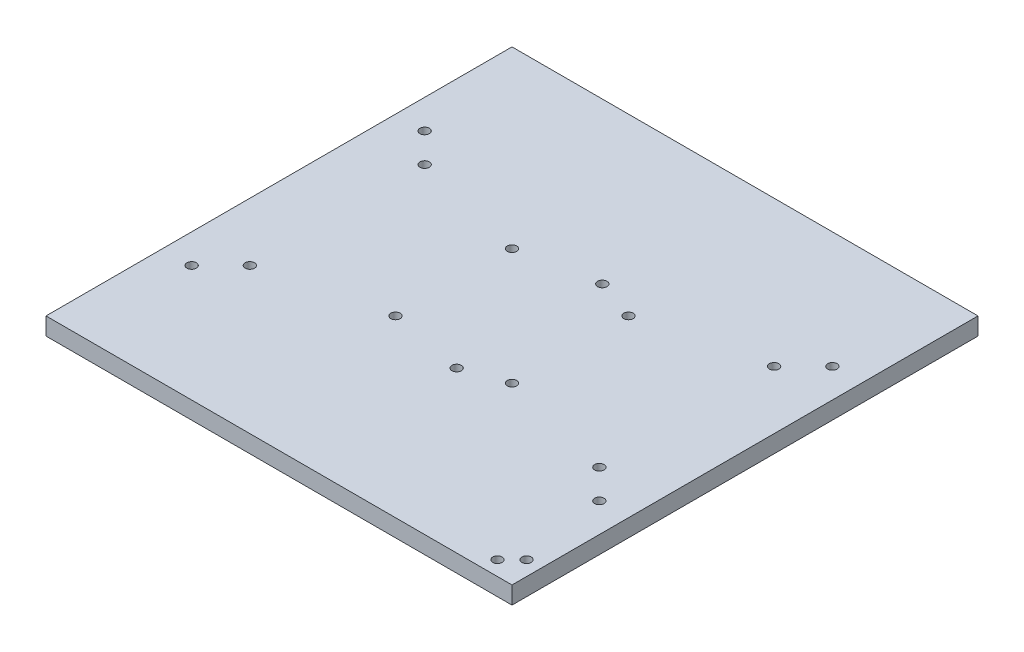
ISO-10303-21;
HEADER;
FILE_DESCRIPTION(('STEP AP214'),'2;1');
FILE_NAME('part.step','',(''),(''),'','','');
FILE_SCHEMA(('AUTOMOTIVE_DESIGN { 1 0 10303 214 1 1 1 1 }'));
ENDSEC;
DATA;
#1=APPLICATION_CONTEXT('core data for automotive mechanical design processes');
#2=APPLICATION_PROTOCOL_DEFINITION('international standard','automotive_design',2000,#1);
#3=PRODUCT_CONTEXT('',#1,'mechanical');
#4=PRODUCT('Part','Part','',(#3));
#5=PRODUCT_RELATED_PRODUCT_CATEGORY('part','',(#4));
#6=PRODUCT_DEFINITION_FORMATION('','',#4);
#7=PRODUCT_DEFINITION_CONTEXT('part definition',#1,'design');
#8=PRODUCT_DEFINITION('design','',#6,#7);
#9=PRODUCT_DEFINITION_SHAPE('','',#8);
#10=(LENGTH_UNIT() NAMED_UNIT(*) SI_UNIT(.MILLI.,.METRE.));
#11=(NAMED_UNIT(*) PLANE_ANGLE_UNIT() SI_UNIT($,.RADIAN.));
#12=(NAMED_UNIT(*) SI_UNIT($,.STERADIAN.) SOLID_ANGLE_UNIT());
#13=UNCERTAINTY_MEASURE_WITH_UNIT(LENGTH_MEASURE(1.E-05),#10,'distance_accuracy_value','');
#14=(GEOMETRIC_REPRESENTATION_CONTEXT(3) GLOBAL_UNCERTAINTY_ASSIGNED_CONTEXT((#13)) GLOBAL_UNIT_ASSIGNED_CONTEXT((#10,
#11,#12)) REPRESENTATION_CONTEXT('',''));
#15=CARTESIAN_POINT('',(0.,0.,0.));
#16=DIRECTION('',(0.,0.,1.));
#17=DIRECTION('',(1.,0.,0.));
#18=AXIS2_PLACEMENT_3D('',#15,#16,#17);
#19=CARTESIAN_POINT('',(0.,6.,0.));
#20=DIRECTION('',(0.,1.,0.));
#21=DIRECTION('',(0.,0.,1.));
#22=AXIS2_PLACEMENT_3D('',#19,#20,#21);
#23=PLANE('',#22);
#24=CARTESIAN_POINT('',(75.,6.,70.));
#25=DIRECTION('',(0.,1.,0.));
#26=DIRECTION('',(0.,0.,1.));
#27=AXIS2_PLACEMENT_3D('',#24,#25,#26);
#28=CIRCLE('',#27,1.61925);
#29=CARTESIAN_POINT('',(75.,6.,71.61925));
#30=VERTEX_POINT('',#29);
#31=EDGE_CURVE('E159',#30,#30,#28,.T.);
#32=ORIENTED_EDGE('',*,*,#31,.F.);
#33=EDGE_LOOP('',(#32));
#34=FACE_BOUND('',#33,.T.);
#35=CARTESIAN_POINT('',(70.,6.,75.));
#36=DIRECTION('',(0.,1.,0.));
#37=DIRECTION('',(0.,0.,1.));
#38=AXIS2_PLACEMENT_3D('',#35,#36,#37);
#39=CIRCLE('',#38,1.61925);
#40=CARTESIAN_POINT('',(70.,6.,76.61925));
#41=VERTEX_POINT('',#40);
#42=EDGE_CURVE('E149',#41,#41,#39,.T.);
#43=ORIENTED_EDGE('',*,*,#42,.F.);
#44=EDGE_LOOP('',(#43));
#45=FACE_BOUND('',#44,.T.);
#46=CARTESIAN_POINT('',(6.,6.,25.));
#47=DIRECTION('',(0.,1.,0.));
#48=DIRECTION('',(0.,0.,1.));
#49=AXIS2_PLACEMENT_3D('',#46,#47,#48);
#50=CIRCLE('',#49,1.61925);
#51=CARTESIAN_POINT('',(6.,6.,26.61925));
#52=VERTEX_POINT('',#51);
#53=EDGE_CURVE('E146',#52,#52,#50,.T.);
#54=ORIENTED_EDGE('',*,*,#53,.F.);
#55=EDGE_LOOP('',(#54));
#56=FACE_BOUND('',#55,.T.);
#57=CARTESIAN_POINT('',(6.,6.,-25.));
#58=DIRECTION('',(0.,1.,0.));
#59=DIRECTION('',(0.,0.,1.));
#60=AXIS2_PLACEMENT_3D('',#57,#58,#59);
#61=CIRCLE('',#60,1.61925);
#62=CARTESIAN_POINT('',(6.,6.,-23.38075));
#63=VERTEX_POINT('',#62);
#64=EDGE_CURVE('E143',#63,#63,#61,.T.);
#65=ORIENTED_EDGE('',*,*,#64,.F.);
#66=EDGE_LOOP('',(#65));
#67=FACE_BOUND('',#66,.T.);
#68=CARTESIAN_POINT('',(20.,6.,-20.));
#69=DIRECTION('',(0.,1.,0.));
#70=DIRECTION('',(0.,0.,1.));
#71=AXIS2_PLACEMENT_3D('',#68,#69,#70);
#72=CIRCLE('',#71,1.61925);
#73=CARTESIAN_POINT('',(20.,6.,-18.38075));
#74=VERTEX_POINT('',#73);
#75=EDGE_CURVE('E133',#74,#74,#72,.T.);
#76=ORIENTED_EDGE('',*,*,#75,.F.);
#77=EDGE_LOOP('',(#76));
#78=FACE_BOUND('',#77,.T.);
#79=CARTESIAN_POINT('',(20.,6.,20.));
#80=DIRECTION('',(0.,1.,0.));
#81=DIRECTION('',(0.,0.,1.));
#82=AXIS2_PLACEMENT_3D('',#79,#80,#81);
#83=CIRCLE('',#82,1.61925);
#84=CARTESIAN_POINT('',(20.,6.,21.61925));
#85=VERTEX_POINT('',#84);
#86=EDGE_CURVE('E166',#85,#85,#83,.T.);
#87=ORIENTED_EDGE('',*,*,#86,.F.);
#88=EDGE_LOOP('',(#87));
#89=FACE_BOUND('',#88,.T.);
#90=CARTESIAN_POINT('',(-20.,6.,20.));
#91=DIRECTION('',(0.,1.,0.));
#92=DIRECTION('',(0.,0.,1.));
#93=AXIS2_PLACEMENT_3D('',#90,#91,#92);
#94=CIRCLE('',#93,1.61925);
#95=CARTESIAN_POINT('',(-20.,6.,21.61925));
#96=VERTEX_POINT('',#95);
#97=EDGE_CURVE('E142',#96,#96,#94,.T.);
#98=ORIENTED_EDGE('',*,*,#97,.F.);
#99=EDGE_LOOP('',(#98));
#100=FACE_BOUND('',#99,.T.);
#101=CARTESIAN_POINT('',(-20.,6.,-20.));
#102=DIRECTION('',(0.,1.,0.));
#103=DIRECTION('',(0.,0.,1.));
#104=AXIS2_PLACEMENT_3D('',#101,#102,#103);
#105=CIRCLE('',#104,1.61925);
#106=CARTESIAN_POINT('',(-20.,6.,-18.38075));
#107=VERTEX_POINT('',#106);
#108=EDGE_CURVE('E128',#107,#107,#105,.T.);
#109=ORIENTED_EDGE('',*,*,#108,.F.);
#110=EDGE_LOOP('',(#109));
#111=FACE_BOUND('',#110,.T.);
#112=CARTESIAN_POINT('',(70.,6.,-40.));
#113=DIRECTION('',(0.,1.,0.));
#114=DIRECTION('',(0.,0.,1.));
#115=AXIS2_PLACEMENT_3D('',#112,#113,#114);
#116=CIRCLE('',#115,1.61925);
#117=CARTESIAN_POINT('',(70.,6.,-38.38075));
#118=VERTEX_POINT('',#117);
#119=EDGE_CURVE('E118',#118,#118,#116,.T.);
#120=ORIENTED_EDGE('',*,*,#119,.F.);
#121=EDGE_LOOP('',(#120));
#122=FACE_BOUND('',#121,.T.);
#123=CARTESIAN_POINT('',(70.,6.,40.));
#124=DIRECTION('',(0.,1.,0.));
#125=DIRECTION('',(0.,0.,1.));
#126=AXIS2_PLACEMENT_3D('',#123,#124,#125);
#127=CIRCLE('',#126,1.61925);
#128=CARTESIAN_POINT('',(70.,6.,41.61925));
#129=VERTEX_POINT('',#128);
#130=EDGE_CURVE('E175',#129,#129,#127,.T.);
#131=ORIENTED_EDGE('',*,*,#130,.F.);
#132=EDGE_LOOP('',(#131));
#133=FACE_BOUND('',#132,.T.);
#134=CARTESIAN_POINT('',(-70.,6.,40.));
#135=DIRECTION('',(0.,1.,0.));
#136=DIRECTION('',(0.,0.,1.));
#137=AXIS2_PLACEMENT_3D('',#134,#135,#136);
#138=CIRCLE('',#137,1.61925);
#139=CARTESIAN_POINT('',(-70.,6.,41.61925));
#140=VERTEX_POINT('',#139);
#141=EDGE_CURVE('E127',#140,#140,#138,.T.);
#142=ORIENTED_EDGE('',*,*,#141,.F.);
#143=EDGE_LOOP('',(#142));
#144=FACE_BOUND('',#143,.T.);
#145=CARTESIAN_POINT('',(-70.,6.,-40.));
#146=DIRECTION('',(0.,1.,0.));
#147=DIRECTION('',(0.,0.,1.));
#148=AXIS2_PLACEMENT_3D('',#145,#146,#147);
#149=CIRCLE('',#148,1.61925);
#150=CARTESIAN_POINT('',(-70.,6.,-38.38075));
#151=VERTEX_POINT('',#150);
#152=EDGE_CURVE('E113',#151,#151,#149,.T.);
#153=ORIENTED_EDGE('',*,*,#152,.F.);
#154=EDGE_LOOP('',(#153));
#155=FACE_BOUND('',#154,.T.);
#156=CARTESIAN_POINT('',(60.,6.,30.));
#157=DIRECTION('',(0.,1.,0.));
#158=DIRECTION('',(0.,0.,1.));
#159=AXIS2_PLACEMENT_3D('',#156,#157,#158);
#160=CIRCLE('',#159,1.61925);
#161=CARTESIAN_POINT('',(60.,6.,31.61925));
#162=VERTEX_POINT('',#161);
#163=EDGE_CURVE('E188',#162,#162,#160,.T.);
#164=ORIENTED_EDGE('',*,*,#163,.F.);
#165=EDGE_LOOP('',(#164));
#166=FACE_BOUND('',#165,.T.);
#167=CARTESIAN_POINT('',(-60.,6.,-30.));
#168=DIRECTION('',(0.,1.,0.));
#169=DIRECTION('',(0.,0.,1.));
#170=AXIS2_PLACEMENT_3D('',#167,#168,#169);
#171=CIRCLE('',#170,1.61925);
#172=CARTESIAN_POINT('',(-60.,6.,-28.38075));
#173=VERTEX_POINT('',#172);
#174=EDGE_CURVE('E103',#173,#173,#171,.T.);
#175=ORIENTED_EDGE('',*,*,#174,.F.);
#176=EDGE_LOOP('',(#175));
#177=FACE_BOUND('',#176,.T.);
#178=DIRECTION('',(0.,0.,-1.));
#179=VECTOR('',#178,1.);
#180=CARTESIAN_POINT('',(80.,6.,-80.));
#181=LINE('',#180,#179);
#182=CARTESIAN_POINT('',(80.,6.,80.));
#183=VERTEX_POINT('',#182);
#184=CARTESIAN_POINT('',(80.,6.,-80.));
#185=VERTEX_POINT('',#184);
#186=EDGE_CURVE('E87',#183,#185,#181,.T.);
#187=ORIENTED_EDGE('',*,*,#186,.T.);
#188=DIRECTION('',(-1.,0.,0.));
#189=VECTOR('',#188,1.);
#190=CARTESIAN_POINT('',(-80.,6.,-80.));
#191=LINE('',#190,#189);
#192=CARTESIAN_POINT('',(-80.,6.,-80.));
#193=VERTEX_POINT('',#192);
#194=EDGE_CURVE('E82',#185,#193,#191,.T.);
#195=ORIENTED_EDGE('',*,*,#194,.T.);
#196=DIRECTION('',(0.,0.,1.));
#197=VECTOR('',#196,1.);
#198=CARTESIAN_POINT('',(-80.,6.,-80.));
#199=LINE('',#198,#197);
#200=CARTESIAN_POINT('',(-80.,6.,80.));
#201=VERTEX_POINT('',#200);
#202=EDGE_CURVE('E85',#193,#201,#199,.T.);
#203=ORIENTED_EDGE('',*,*,#202,.T.);
#204=DIRECTION('',(1.,0.,0.));
#205=VECTOR('',#204,1.);
#206=CARTESIAN_POINT('',(-80.,6.,80.));
#207=LINE('',#206,#205);
#208=EDGE_CURVE('E52',#201,#183,#207,.T.);
#209=ORIENTED_EDGE('',*,*,#208,.T.);
#210=EDGE_LOOP('',(#187,#195,#203,#209));
#211=FACE_BOUND('',#210,.T.);
#212=CARTESIAN_POINT('',(-60.,6.,30.));
#213=DIRECTION('',(0.,1.,0.));
#214=DIRECTION('',(0.,0.,1.));
#215=AXIS2_PLACEMENT_3D('',#212,#213,#214);
#216=CIRCLE('',#215,1.61925);
#217=CARTESIAN_POINT('',(-60.,6.,31.61925));
#218=VERTEX_POINT('',#217);
#219=EDGE_CURVE('E194',#218,#218,#216,.T.);
#220=ORIENTED_EDGE('',*,*,#219,.F.);
#221=EDGE_LOOP('',(#220));
#222=FACE_BOUND('',#221,.T.);
#223=CARTESIAN_POINT('',(60.,6.,-30.));
#224=DIRECTION('',(0.,1.,0.));
#225=DIRECTION('',(0.,0.,1.));
#226=AXIS2_PLACEMENT_3D('',#223,#224,#225);
#227=CIRCLE('',#226,1.61925);
#228=CARTESIAN_POINT('',(60.,6.,-28.38075));
#229=VERTEX_POINT('',#228);
#230=EDGE_CURVE('E182',#229,#229,#227,.T.);
#231=ORIENTED_EDGE('',*,*,#230,.F.);
#232=EDGE_LOOP('',(#231));
#233=FACE_BOUND('',#232,.T.);
#234=ADVANCED_FACE('F33',(#34,#45,#56,#67,#78,#89,#100,#111,#122,#133,#144,#155,#166,#177,#211,
#222,#233),#23,.T.);
#235=CARTESIAN_POINT('',(0.,0.,0.));
#236=DIRECTION('',(0.,1.,0.));
#237=DIRECTION('',(0.,0.,1.));
#238=AXIS2_PLACEMENT_3D('',#235,#236,#237);
#239=PLANE('',#238);
#240=CARTESIAN_POINT('',(75.,0.,70.));
#241=DIRECTION('',(0.,1.,0.));
#242=DIRECTION('',(0.,0.,1.));
#243=AXIS2_PLACEMENT_3D('',#240,#241,#242);
#244=CIRCLE('',#243,1.61925);
#245=CARTESIAN_POINT('',(75.,0.,71.61925));
#246=VERTEX_POINT('',#245);
#247=EDGE_CURVE('E37',#246,#246,#244,.T.);
#248=ORIENTED_EDGE('',*,*,#247,.T.);
#249=EDGE_LOOP('',(#248));
#250=FACE_BOUND('',#249,.T.);
#251=CARTESIAN_POINT('',(70.,0.,75.));
#252=DIRECTION('',(0.,1.,0.));
#253=DIRECTION('',(0.,0.,1.));
#254=AXIS2_PLACEMENT_3D('',#251,#252,#253);
#255=CIRCLE('',#254,1.61925);
#256=CARTESIAN_POINT('',(70.,0.,76.61925));
#257=VERTEX_POINT('',#256);
#258=EDGE_CURVE('E147',#257,#257,#255,.T.);
#259=ORIENTED_EDGE('',*,*,#258,.T.);
#260=EDGE_LOOP('',(#259));
#261=FACE_BOUND('',#260,.T.);
#262=CARTESIAN_POINT('',(6.,0.,25.));
#263=DIRECTION('',(0.,1.,0.));
#264=DIRECTION('',(0.,0.,1.));
#265=AXIS2_PLACEMENT_3D('',#262,#263,#264);
#266=CIRCLE('',#265,1.61925);
#267=CARTESIAN_POINT('',(6.,0.,26.61925));
#268=VERTEX_POINT('',#267);
#269=EDGE_CURVE('E144',#268,#268,#266,.T.);
#270=ORIENTED_EDGE('',*,*,#269,.T.);
#271=EDGE_LOOP('',(#270));
#272=FACE_BOUND('',#271,.T.);
#273=CARTESIAN_POINT('',(6.,0.,-25.));
#274=DIRECTION('',(0.,1.,0.));
#275=DIRECTION('',(0.,0.,1.));
#276=AXIS2_PLACEMENT_3D('',#273,#274,#275);
#277=CIRCLE('',#276,1.61925);
#278=CARTESIAN_POINT('',(6.,0.,-23.38075));
#279=VERTEX_POINT('',#278);
#280=EDGE_CURVE('E139',#279,#279,#277,.T.);
#281=ORIENTED_EDGE('',*,*,#280,.T.);
#282=EDGE_LOOP('',(#281));
#283=FACE_BOUND('',#282,.T.);
#284=CARTESIAN_POINT('',(20.,0.,-20.));
#285=DIRECTION('',(0.,1.,0.));
#286=DIRECTION('',(0.,0.,1.));
#287=AXIS2_PLACEMENT_3D('',#284,#285,#286);
#288=CIRCLE('',#287,1.61925);
#289=CARTESIAN_POINT('',(20.,0.,-18.38075));
#290=VERTEX_POINT('',#289);
#291=EDGE_CURVE('E136',#290,#290,#288,.T.);
#292=ORIENTED_EDGE('',*,*,#291,.T.);
#293=EDGE_LOOP('',(#292));
#294=FACE_BOUND('',#293,.T.);
#295=CARTESIAN_POINT('',(20.,0.,20.));
#296=DIRECTION('',(0.,1.,0.));
#297=DIRECTION('',(0.,0.,1.));
#298=AXIS2_PLACEMENT_3D('',#295,#296,#297);
#299=CIRCLE('',#298,1.61925);
#300=CARTESIAN_POINT('',(20.,0.,21.61925));
#301=VERTEX_POINT('',#300);
#302=EDGE_CURVE('E132',#301,#301,#299,.T.);
#303=ORIENTED_EDGE('',*,*,#302,.T.);
#304=EDGE_LOOP('',(#303));
#305=FACE_BOUND('',#304,.T.);
#306=CARTESIAN_POINT('',(-20.,0.,20.));
#307=DIRECTION('',(0.,1.,0.));
#308=DIRECTION('',(0.,0.,1.));
#309=AXIS2_PLACEMENT_3D('',#306,#307,#308);
#310=CIRCLE('',#309,1.61925);
#311=CARTESIAN_POINT('',(-20.,0.,21.61925));
#312=VERTEX_POINT('',#311);
#313=EDGE_CURVE('E129',#312,#312,#310,.T.);
#314=ORIENTED_EDGE('',*,*,#313,.T.);
#315=EDGE_LOOP('',(#314));
#316=FACE_BOUND('',#315,.T.);
#317=CARTESIAN_POINT('',(-20.,0.,-20.));
#318=DIRECTION('',(0.,1.,0.));
#319=DIRECTION('',(0.,0.,1.));
#320=AXIS2_PLACEMENT_3D('',#317,#318,#319);
#321=CIRCLE('',#320,1.61925);
#322=CARTESIAN_POINT('',(-20.,0.,-18.38075));
#323=VERTEX_POINT('',#322);
#324=EDGE_CURVE('E124',#323,#323,#321,.T.);
#325=ORIENTED_EDGE('',*,*,#324,.T.);
#326=EDGE_LOOP('',(#325));
#327=FACE_BOUND('',#326,.T.);
#328=CARTESIAN_POINT('',(70.,0.,-40.));
#329=DIRECTION('',(0.,1.,0.));
#330=DIRECTION('',(0.,0.,1.));
#331=AXIS2_PLACEMENT_3D('',#328,#329,#330);
#332=CIRCLE('',#331,1.61925);
#333=CARTESIAN_POINT('',(70.,0.,-38.38075));
#334=VERTEX_POINT('',#333);
#335=EDGE_CURVE('E121',#334,#334,#332,.T.);
#336=ORIENTED_EDGE('',*,*,#335,.T.);
#337=EDGE_LOOP('',(#336));
#338=FACE_BOUND('',#337,.T.);
#339=CARTESIAN_POINT('',(70.,0.,40.));
#340=DIRECTION('',(0.,1.,0.));
#341=DIRECTION('',(0.,0.,1.));
#342=AXIS2_PLACEMENT_3D('',#339,#340,#341);
#343=CIRCLE('',#342,1.61925);
#344=CARTESIAN_POINT('',(70.,0.,41.61925));
#345=VERTEX_POINT('',#344);
#346=EDGE_CURVE('E117',#345,#345,#343,.T.);
#347=ORIENTED_EDGE('',*,*,#346,.T.);
#348=EDGE_LOOP('',(#347));
#349=FACE_BOUND('',#348,.T.);
#350=CARTESIAN_POINT('',(-70.,0.,40.));
#351=DIRECTION('',(0.,1.,0.));
#352=DIRECTION('',(0.,0.,1.));
#353=AXIS2_PLACEMENT_3D('',#350,#351,#352);
#354=CIRCLE('',#353,1.61925);
#355=CARTESIAN_POINT('',(-70.,0.,41.61925));
#356=VERTEX_POINT('',#355);
#357=EDGE_CURVE('E114',#356,#356,#354,.T.);
#358=ORIENTED_EDGE('',*,*,#357,.T.);
#359=EDGE_LOOP('',(#358));
#360=FACE_BOUND('',#359,.T.);
#361=CARTESIAN_POINT('',(-70.,0.,-40.));
#362=DIRECTION('',(0.,1.,0.));
#363=DIRECTION('',(0.,0.,1.));
#364=AXIS2_PLACEMENT_3D('',#361,#362,#363);
#365=CIRCLE('',#364,1.61925);
#366=CARTESIAN_POINT('',(-70.,0.,-38.38075));
#367=VERTEX_POINT('',#366);
#368=EDGE_CURVE('E109',#367,#367,#365,.T.);
#369=ORIENTED_EDGE('',*,*,#368,.T.);
#370=EDGE_LOOP('',(#369));
#371=FACE_BOUND('',#370,.T.);
#372=DIRECTION('',(0.,0.,-1.));
#373=VECTOR('',#372,1.);
#374=CARTESIAN_POINT('',(80.,0.,-80.));
#375=LINE('',#374,#373);
#376=CARTESIAN_POINT('',(80.,0.,80.));
#377=VERTEX_POINT('',#376);
#378=CARTESIAN_POINT('',(80.,0.,-80.));
#379=VERTEX_POINT('',#378);
#380=EDGE_CURVE('E100',#377,#379,#375,.T.);
#381=ORIENTED_EDGE('',*,*,#380,.F.);
#382=DIRECTION('',(1.,0.,0.));
#383=VECTOR('',#382,1.);
#384=CARTESIAN_POINT('',(-80.,0.,80.));
#385=LINE('',#384,#383);
#386=CARTESIAN_POINT('',(-80.,0.,80.));
#387=VERTEX_POINT('',#386);
#388=EDGE_CURVE('E75',#387,#377,#385,.T.);
#389=ORIENTED_EDGE('',*,*,#388,.F.);
#390=DIRECTION('',(0.,0.,1.));
#391=VECTOR('',#390,1.);
#392=CARTESIAN_POINT('',(-80.,0.,-80.));
#393=LINE('',#392,#391);
#394=CARTESIAN_POINT('',(-80.,0.,-80.));
#395=VERTEX_POINT('',#394);
#396=EDGE_CURVE('E69',#395,#387,#393,.T.);
#397=ORIENTED_EDGE('',*,*,#396,.F.);
#398=DIRECTION('',(-1.,0.,0.));
#399=VECTOR('',#398,1.);
#400=CARTESIAN_POINT('',(-80.,0.,-80.));
#401=LINE('',#400,#399);
#402=EDGE_CURVE('E91',#379,#395,#401,.T.);
#403=ORIENTED_EDGE('',*,*,#402,.F.);
#404=EDGE_LOOP('',(#381,#389,#397,#403));
#405=FACE_BOUND('',#404,.T.);
#406=CARTESIAN_POINT('',(-60.,0.,-30.));
#407=DIRECTION('',(0.,1.,0.));
#408=DIRECTION('',(0.,0.,1.));
#409=AXIS2_PLACEMENT_3D('',#406,#407,#408);
#410=CIRCLE('',#409,1.61925);
#411=CARTESIAN_POINT('',(-60.,0.,-28.38075));
#412=VERTEX_POINT('',#411);
#413=EDGE_CURVE('E197',#412,#412,#410,.T.);
#414=ORIENTED_EDGE('',*,*,#413,.T.);
#415=EDGE_LOOP('',(#414));
#416=FACE_BOUND('',#415,.T.);
#417=CARTESIAN_POINT('',(-60.,0.,30.));
#418=DIRECTION('',(0.,1.,0.));
#419=DIRECTION('',(0.,0.,1.));
#420=AXIS2_PLACEMENT_3D('',#417,#418,#419);
#421=CIRCLE('',#420,1.61925);
#422=CARTESIAN_POINT('',(-60.,0.,31.61925));
#423=VERTEX_POINT('',#422);
#424=EDGE_CURVE('E191',#423,#423,#421,.T.);
#425=ORIENTED_EDGE('',*,*,#424,.T.);
#426=EDGE_LOOP('',(#425));
#427=FACE_BOUND('',#426,.T.);
#428=CARTESIAN_POINT('',(60.,0.,30.));
#429=DIRECTION('',(0.,1.,0.));
#430=DIRECTION('',(0.,0.,1.));
#431=AXIS2_PLACEMENT_3D('',#428,#429,#430);
#432=CIRCLE('',#431,1.61925);
#433=CARTESIAN_POINT('',(60.,0.,31.61925));
#434=VERTEX_POINT('',#433);
#435=EDGE_CURVE('E185',#434,#434,#432,.T.);
#436=ORIENTED_EDGE('',*,*,#435,.T.);
#437=EDGE_LOOP('',(#436));
#438=FACE_BOUND('',#437,.T.);
#439=CARTESIAN_POINT('',(60.,0.,-30.));
#440=DIRECTION('',(0.,1.,0.));
#441=DIRECTION('',(0.,0.,1.));
#442=AXIS2_PLACEMENT_3D('',#439,#440,#441);
#443=CIRCLE('',#442,1.61925);
#444=CARTESIAN_POINT('',(60.,0.,-28.38075));
#445=VERTEX_POINT('',#444);
#446=EDGE_CURVE('E112',#445,#445,#443,.T.);
#447=ORIENTED_EDGE('',*,*,#446,.T.);
#448=EDGE_LOOP('',(#447));
#449=FACE_BOUND('',#448,.T.);
#450=ADVANCED_FACE('F205',(#250,#261,#272,#283,#294,#305,#316,#327,#338,#349,#360,#371,#405,
#416,#427,#438,#449),#239,.F.);
#451=CARTESIAN_POINT('',(80.,6.,-80.));
#452=DIRECTION('',(-1.,0.,0.));
#453=DIRECTION('',(0.,0.,1.));
#454=AXIS2_PLACEMENT_3D('',#451,#452,#453);
#455=PLANE('',#454);
#456=ORIENTED_EDGE('',*,*,#380,.T.);
#457=DIRECTION('',(0.,-1.,0.));
#458=VECTOR('',#457,1.);
#459=CARTESIAN_POINT('',(80.,6.,-80.));
#460=LINE('',#459,#458);
#461=EDGE_CURVE('E11',#185,#379,#460,.T.);
#462=ORIENTED_EDGE('',*,*,#461,.F.);
#463=ORIENTED_EDGE('',*,*,#186,.F.);
#464=DIRECTION('',(0.,-1.,0.));
#465=VECTOR('',#464,1.);
#466=CARTESIAN_POINT('',(80.,6.,80.));
#467=LINE('',#466,#465);
#468=EDGE_CURVE('E96',#183,#377,#467,.T.);
#469=ORIENTED_EDGE('',*,*,#468,.T.);
#470=EDGE_LOOP('',(#456,#462,#463,#469));
#471=FACE_BOUND('',#470,.T.);
#472=ADVANCED_FACE('F35',(#471),#455,.F.);
#473=CARTESIAN_POINT('',(-80.,6.,-80.));
#474=DIRECTION('',(0.,0.,1.));
#475=DIRECTION('',(1.,0.,0.));
#476=AXIS2_PLACEMENT_3D('',#473,#474,#475);
#477=PLANE('',#476);
#478=ORIENTED_EDGE('',*,*,#402,.T.);
#479=DIRECTION('',(0.,-1.,0.));
#480=VECTOR('',#479,1.);
#481=CARTESIAN_POINT('',(-80.,6.,-80.));
#482=LINE('',#481,#480);
#483=EDGE_CURVE('E43',#193,#395,#482,.T.);
#484=ORIENTED_EDGE('',*,*,#483,.F.);
#485=ORIENTED_EDGE('',*,*,#194,.F.);
#486=ORIENTED_EDGE('',*,*,#461,.T.);
#487=EDGE_LOOP('',(#478,#484,#485,#486));
#488=FACE_BOUND('',#487,.T.);
#489=ADVANCED_FACE('F90',(#488),#477,.F.);
#490=CARTESIAN_POINT('',(-80.,6.,-80.));
#491=DIRECTION('',(1.,0.,0.));
#492=DIRECTION('',(0.,0.,-1.));
#493=AXIS2_PLACEMENT_3D('',#490,#491,#492);
#494=PLANE('',#493);
#495=ORIENTED_EDGE('',*,*,#396,.T.);
#496=DIRECTION('',(0.,-1.,0.));
#497=VECTOR('',#496,1.);
#498=CARTESIAN_POINT('',(-80.,6.,80.));
#499=LINE('',#498,#497);
#500=EDGE_CURVE('E92',#201,#387,#499,.T.);
#501=ORIENTED_EDGE('',*,*,#500,.F.);
#502=ORIENTED_EDGE('',*,*,#202,.F.);
#503=ORIENTED_EDGE('',*,*,#483,.T.);
#504=EDGE_LOOP('',(#495,#501,#502,#503));
#505=FACE_BOUND('',#504,.T.);
#506=ADVANCED_FACE('F94',(#505),#494,.F.);
#507=CARTESIAN_POINT('',(-80.,6.,80.));
#508=DIRECTION('',(0.,0.,-1.));
#509=DIRECTION('',(-1.,0.,0.));
#510=AXIS2_PLACEMENT_3D('',#507,#508,#509);
#511=PLANE('',#510);
#512=ORIENTED_EDGE('',*,*,#388,.T.);
#513=ORIENTED_EDGE('',*,*,#468,.F.);
#514=ORIENTED_EDGE('',*,*,#208,.F.);
#515=ORIENTED_EDGE('',*,*,#500,.T.);
#516=EDGE_LOOP('',(#512,#513,#514,#515));
#517=FACE_BOUND('',#516,.T.);
#518=ADVANCED_FACE('F211',(#517),#511,.F.);
#519=CARTESIAN_POINT('',(-60.,6.,-30.));
#520=DIRECTION('',(0.,-1.,0.));
#521=DIRECTION('',(0.,0.,-1.));
#522=AXIS2_PLACEMENT_3D('',#519,#520,#521);
#523=CYLINDRICAL_SURFACE('',#522,1.61925);
#524=ORIENTED_EDGE('',*,*,#174,.T.);
#525=EDGE_LOOP('',(#524));
#526=FACE_BOUND('',#525,.T.);
#527=ORIENTED_EDGE('',*,*,#413,.F.);
#528=EDGE_LOOP('',(#527));
#529=FACE_BOUND('',#528,.T.);
#530=ADVANCED_FACE('F208',(#526,#529),#523,.F.);
#531=CARTESIAN_POINT('',(-60.,6.,30.));
#532=DIRECTION('',(0.,-1.,0.));
#533=DIRECTION('',(0.,0.,-1.));
#534=AXIS2_PLACEMENT_3D('',#531,#532,#533);
#535=CYLINDRICAL_SURFACE('',#534,1.61925);
#536=ORIENTED_EDGE('',*,*,#219,.T.);
#537=EDGE_LOOP('',(#536));
#538=FACE_BOUND('',#537,.T.);
#539=ORIENTED_EDGE('',*,*,#424,.F.);
#540=EDGE_LOOP('',(#539));
#541=FACE_BOUND('',#540,.T.);
#542=ADVANCED_FACE('F210',(#538,#541),#535,.F.);
#543=CARTESIAN_POINT('',(60.,6.,30.));
#544=DIRECTION('',(0.,-1.,0.));
#545=DIRECTION('',(0.,0.,-1.));
#546=AXIS2_PLACEMENT_3D('',#543,#544,#545);
#547=CYLINDRICAL_SURFACE('',#546,1.61925);
#548=ORIENTED_EDGE('',*,*,#163,.T.);
#549=EDGE_LOOP('',(#548));
#550=FACE_BOUND('',#549,.T.);
#551=ORIENTED_EDGE('',*,*,#435,.F.);
#552=EDGE_LOOP('',(#551));
#553=FACE_BOUND('',#552,.T.);
#554=ADVANCED_FACE('F218',(#550,#553),#547,.F.);
#555=CARTESIAN_POINT('',(60.,6.,-30.));
#556=DIRECTION('',(0.,-1.,0.));
#557=DIRECTION('',(0.,0.,-1.));
#558=AXIS2_PLACEMENT_3D('',#555,#556,#557);
#559=CYLINDRICAL_SURFACE('',#558,1.61925);
#560=ORIENTED_EDGE('',*,*,#230,.T.);
#561=EDGE_LOOP('',(#560));
#562=FACE_BOUND('',#561,.T.);
#563=ORIENTED_EDGE('',*,*,#446,.F.);
#564=EDGE_LOOP('',(#563));
#565=FACE_BOUND('',#564,.T.);
#566=ADVANCED_FACE('F318',(#562,#565),#559,.F.);
#567=CARTESIAN_POINT('',(-70.,-4.,-40.));
#568=DIRECTION('',(0.,1.,0.));
#569=DIRECTION('',(0.,0.,1.));
#570=AXIS2_PLACEMENT_3D('',#567,#568,#569);
#571=CYLINDRICAL_SURFACE('',#570,1.61925);
#572=ORIENTED_EDGE('',*,*,#152,.T.);
#573=EDGE_LOOP('',(#572));
#574=FACE_BOUND('',#573,.T.);
#575=ORIENTED_EDGE('',*,*,#368,.F.);
#576=EDGE_LOOP('',(#575));
#577=FACE_BOUND('',#576,.T.);
#578=ADVANCED_FACE('F314',(#574,#577),#571,.F.);
#579=CARTESIAN_POINT('',(-70.,-4.,40.));
#580=DIRECTION('',(0.,1.,0.));
#581=DIRECTION('',(0.,0.,1.));
#582=AXIS2_PLACEMENT_3D('',#579,#580,#581);
#583=CYLINDRICAL_SURFACE('',#582,1.61925);
#584=ORIENTED_EDGE('',*,*,#141,.T.);
#585=EDGE_LOOP('',(#584));
#586=FACE_BOUND('',#585,.T.);
#587=ORIENTED_EDGE('',*,*,#357,.F.);
#588=EDGE_LOOP('',(#587));
#589=FACE_BOUND('',#588,.T.);
#590=ADVANCED_FACE('F310',(#586,#589),#583,.F.);
#591=CARTESIAN_POINT('',(70.,-4.,40.));
#592=DIRECTION('',(0.,1.,0.));
#593=DIRECTION('',(0.,0.,1.));
#594=AXIS2_PLACEMENT_3D('',#591,#592,#593);
#595=CYLINDRICAL_SURFACE('',#594,1.61925);
#596=ORIENTED_EDGE('',*,*,#130,.T.);
#597=EDGE_LOOP('',(#596));
#598=FACE_BOUND('',#597,.T.);
#599=ORIENTED_EDGE('',*,*,#346,.F.);
#600=EDGE_LOOP('',(#599));
#601=FACE_BOUND('',#600,.T.);
#602=ADVANCED_FACE('F306',(#598,#601),#595,.F.);
#603=CARTESIAN_POINT('',(70.,-4.,-40.));
#604=DIRECTION('',(0.,1.,0.));
#605=DIRECTION('',(0.,0.,1.));
#606=AXIS2_PLACEMENT_3D('',#603,#604,#605);
#607=CYLINDRICAL_SURFACE('',#606,1.61925);
#608=ORIENTED_EDGE('',*,*,#119,.T.);
#609=EDGE_LOOP('',(#608));
#610=FACE_BOUND('',#609,.T.);
#611=ORIENTED_EDGE('',*,*,#335,.F.);
#612=EDGE_LOOP('',(#611));
#613=FACE_BOUND('',#612,.T.);
#614=ADVANCED_FACE('F302',(#610,#613),#607,.F.);
#615=CARTESIAN_POINT('',(-20.,-4.,-20.));
#616=DIRECTION('',(0.,1.,0.));
#617=DIRECTION('',(0.,0.,1.));
#618=AXIS2_PLACEMENT_3D('',#615,#616,#617);
#619=CYLINDRICAL_SURFACE('',#618,1.61925);
#620=ORIENTED_EDGE('',*,*,#108,.T.);
#621=EDGE_LOOP('',(#620));
#622=FACE_BOUND('',#621,.T.);
#623=ORIENTED_EDGE('',*,*,#324,.F.);
#624=EDGE_LOOP('',(#623));
#625=FACE_BOUND('',#624,.T.);
#626=ADVANCED_FACE('F298',(#622,#625),#619,.F.);
#627=CARTESIAN_POINT('',(-20.,-4.,20.));
#628=DIRECTION('',(0.,1.,0.));
#629=DIRECTION('',(0.,0.,1.));
#630=AXIS2_PLACEMENT_3D('',#627,#628,#629);
#631=CYLINDRICAL_SURFACE('',#630,1.61925);
#632=ORIENTED_EDGE('',*,*,#97,.T.);
#633=EDGE_LOOP('',(#632));
#634=FACE_BOUND('',#633,.T.);
#635=ORIENTED_EDGE('',*,*,#313,.F.);
#636=EDGE_LOOP('',(#635));
#637=FACE_BOUND('',#636,.T.);
#638=ADVANCED_FACE('F294',(#634,#637),#631,.F.);
#639=CARTESIAN_POINT('',(20.,-4.,20.));
#640=DIRECTION('',(0.,1.,0.));
#641=DIRECTION('',(0.,0.,1.));
#642=AXIS2_PLACEMENT_3D('',#639,#640,#641);
#643=CYLINDRICAL_SURFACE('',#642,1.61925);
#644=ORIENTED_EDGE('',*,*,#86,.T.);
#645=EDGE_LOOP('',(#644));
#646=FACE_BOUND('',#645,.T.);
#647=ORIENTED_EDGE('',*,*,#302,.F.);
#648=EDGE_LOOP('',(#647));
#649=FACE_BOUND('',#648,.T.);
#650=ADVANCED_FACE('F290',(#646,#649),#643,.F.);
#651=CARTESIAN_POINT('',(20.,-4.,-20.));
#652=DIRECTION('',(0.,1.,0.));
#653=DIRECTION('',(0.,0.,1.));
#654=AXIS2_PLACEMENT_3D('',#651,#652,#653);
#655=CYLINDRICAL_SURFACE('',#654,1.61925);
#656=ORIENTED_EDGE('',*,*,#75,.T.);
#657=EDGE_LOOP('',(#656));
#658=FACE_BOUND('',#657,.T.);
#659=ORIENTED_EDGE('',*,*,#291,.F.);
#660=EDGE_LOOP('',(#659));
#661=FACE_BOUND('',#660,.T.);
#662=ADVANCED_FACE('F286',(#658,#661),#655,.F.);
#663=CARTESIAN_POINT('',(6.,-4.,-25.));
#664=DIRECTION('',(0.,1.,0.));
#665=DIRECTION('',(0.,0.,1.));
#666=AXIS2_PLACEMENT_3D('',#663,#664,#665);
#667=CYLINDRICAL_SURFACE('',#666,1.61925);
#668=ORIENTED_EDGE('',*,*,#64,.T.);
#669=EDGE_LOOP('',(#668));
#670=FACE_BOUND('',#669,.T.);
#671=ORIENTED_EDGE('',*,*,#280,.F.);
#672=EDGE_LOOP('',(#671));
#673=FACE_BOUND('',#672,.T.);
#674=ADVANCED_FACE('F282',(#670,#673),#667,.F.);
#675=CARTESIAN_POINT('',(6.,-4.,25.));
#676=DIRECTION('',(0.,1.,0.));
#677=DIRECTION('',(0.,0.,1.));
#678=AXIS2_PLACEMENT_3D('',#675,#676,#677);
#679=CYLINDRICAL_SURFACE('',#678,1.61925);
#680=ORIENTED_EDGE('',*,*,#53,.T.);
#681=EDGE_LOOP('',(#680));
#682=FACE_BOUND('',#681,.T.);
#683=ORIENTED_EDGE('',*,*,#269,.F.);
#684=EDGE_LOOP('',(#683));
#685=FACE_BOUND('',#684,.T.);
#686=ADVANCED_FACE('F263',(#682,#685),#679,.F.);
#687=CARTESIAN_POINT('',(70.,-7.,75.));
#688=DIRECTION('',(0.,1.,0.));
#689=DIRECTION('',(0.,0.,1.));
#690=AXIS2_PLACEMENT_3D('',#687,#688,#689);
#691=CYLINDRICAL_SURFACE('',#690,1.61925);
#692=ORIENTED_EDGE('',*,*,#42,.T.);
#693=EDGE_LOOP('',(#692));
#694=FACE_BOUND('',#693,.T.);
#695=ORIENTED_EDGE('',*,*,#258,.F.);
#696=EDGE_LOOP('',(#695));
#697=FACE_BOUND('',#696,.T.);
#698=ADVANCED_FACE('F257',(#694,#697),#691,.F.);
#699=CARTESIAN_POINT('',(75.,-7.,70.));
#700=DIRECTION('',(0.,1.,0.));
#701=DIRECTION('',(0.,0.,1.));
#702=AXIS2_PLACEMENT_3D('',#699,#700,#701);
#703=CYLINDRICAL_SURFACE('',#702,1.61925);
#704=ORIENTED_EDGE('',*,*,#31,.T.);
#705=EDGE_LOOP('',(#704));
#706=FACE_BOUND('',#705,.T.);
#707=ORIENTED_EDGE('',*,*,#247,.F.);
#708=EDGE_LOOP('',(#707));
#709=FACE_BOUND('',#708,.T.);
#710=ADVANCED_FACE('F262',(#706,#709),#703,.F.);
#711=CLOSED_SHELL('',(#234,#450,#472,#489,#506,#518,#530,#542,#554,#566,#578,#590,#602,#614,
#626,#638,#650,#662,#674,#686,#698,#710));
#712=MANIFOLD_SOLID_BREP('B2',#711);
#713=ADVANCED_BREP_SHAPE_REPRESENTATION('',(#18,#712),#14);
#714=SHAPE_DEFINITION_REPRESENTATION(#9,#713);
ENDSEC;
END-ISO-10303-21;
